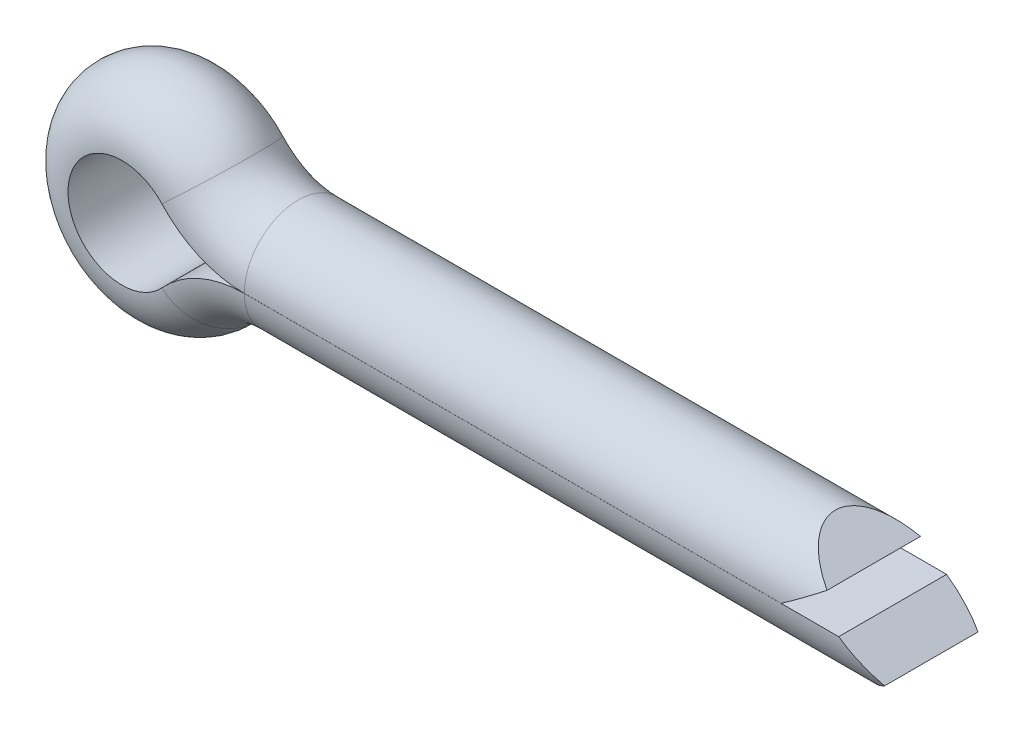
ISO-10303-21;
HEADER;
FILE_DESCRIPTION(('STEP AP214'),'2;1');
FILE_NAME('part.step','',(''),(''),'','','');
FILE_SCHEMA(('AUTOMOTIVE_DESIGN { 1 0 10303 214 1 1 1 1 }'));
ENDSEC;
DATA;
#1=APPLICATION_CONTEXT('core data for automotive mechanical design processes');
#2=APPLICATION_PROTOCOL_DEFINITION('international standard','automotive_design',2000,#1);
#3=PRODUCT_CONTEXT('',#1,'mechanical');
#4=PRODUCT('Part','Part','',(#3));
#5=PRODUCT_RELATED_PRODUCT_CATEGORY('part','',(#4));
#6=PRODUCT_DEFINITION_FORMATION('','',#4);
#7=PRODUCT_DEFINITION_CONTEXT('part definition',#1,'design');
#8=PRODUCT_DEFINITION('design','',#6,#7);
#9=PRODUCT_DEFINITION_SHAPE('','',#8);
#10=(LENGTH_UNIT() NAMED_UNIT(*) SI_UNIT(.MILLI.,.METRE.));
#11=(NAMED_UNIT(*) PLANE_ANGLE_UNIT() SI_UNIT($,.RADIAN.));
#12=(NAMED_UNIT(*) SI_UNIT($,.STERADIAN.) SOLID_ANGLE_UNIT());
#13=UNCERTAINTY_MEASURE_WITH_UNIT(LENGTH_MEASURE(1.E-05),#10,'distance_accuracy_value','');
#14=(GEOMETRIC_REPRESENTATION_CONTEXT(3) GLOBAL_UNCERTAINTY_ASSIGNED_CONTEXT((#13)) GLOBAL_UNIT_ASSIGNED_CONTEXT((#10,
#11,#12)) REPRESENTATION_CONTEXT('',''));
#15=CARTESIAN_POINT('',(0.,0.,0.));
#16=DIRECTION('',(0.,0.,1.));
#17=DIRECTION('',(1.,0.,0.));
#18=AXIS2_PLACEMENT_3D('',#15,#16,#17);
#19=CARTESIAN_POINT('',(0.,-0.00199999999999983,3.74999946666663));
#20=DIRECTION('',(0.,-1.,0.));
#21=DIRECTION('',(1.,0.,0.));
#22=AXIS2_PLACEMENT_3D('',#19,#20,#21);
#23=PLANE('',#22);
#24=DIRECTION('',(1.,0.,0.));
#25=VECTOR('',#24,1.);
#26=CARTESIAN_POINT('',(0.,-0.00199999999999983,3.74999946666663));
#27=LINE('',#26,#25);
#28=CARTESIAN_POINT('',(0.,-0.00199999999999983,3.74999946666663));
#29=VERTEX_POINT('',#28);
#30=CARTESIAN_POINT('',(41.3151462893286,-0.00200000000000005,3.74999946666663));
#31=VERTEX_POINT('',#30);
#32=EDGE_CURVE('E43',#29,#31,#27,.T.);
#33=ORIENTED_EDGE('',*,*,#32,.T.);
#34=DIRECTION('',(0.,0.,-1.));
#35=VECTOR('',#34,1.);
#36=CARTESIAN_POINT('',(41.3151462893286,-0.00200000000000065,3.74999946666663));
#37=LINE('',#36,#35);
#38=CARTESIAN_POINT('',(41.3151462893286,-0.00200000000000005,-3.74999946666663));
#39=VERTEX_POINT('',#38);
#40=EDGE_CURVE('E99',#31,#39,#37,.T.);
#41=ORIENTED_EDGE('',*,*,#40,.T.);
#42=DIRECTION('',(1.,0.,0.));
#43=VECTOR('',#42,1.);
#44=CARTESIAN_POINT('',(0.,-0.00199999999999983,-3.74999946666663));
#45=LINE('',#44,#43);
#46=CARTESIAN_POINT('',(0.,-0.00199999999999983,-3.74999946666663));
#47=VERTEX_POINT('',#46);
#48=EDGE_CURVE('E11',#47,#39,#45,.T.);
#49=ORIENTED_EDGE('',*,*,#48,.F.);
#50=DIRECTION('',(0.,0.,-1.));
#51=VECTOR('',#50,1.);
#52=CARTESIAN_POINT('',(0.,-0.00199999999999983,3.74999946666663));
#53=LINE('',#52,#51);
#54=EDGE_CURVE('E116',#29,#47,#53,.T.);
#55=ORIENTED_EDGE('',*,*,#54,.F.);
#56=EDGE_LOOP('',(#33,#41,#49,#55));
#57=FACE_BOUND('',#56,.T.);
#58=ADVANCED_FACE('F36',(#57),#23,.F.);
#59=CARTESIAN_POINT('',(0.,0.,0.));
#60=DIRECTION('',(1.,0.,0.));
#61=DIRECTION('',(0.,1.,0.));
#62=AXIS2_PLACEMENT_3D('',#59,#60,#61);
#63=CYLINDRICAL_SURFACE('',#62,3.75);
#64=CARTESIAN_POINT('',(46.6707283888811,0.,0.));
#65=DIRECTION('',(-0.574796173863874,0.818296620127109,0.));
#66=DIRECTION('',(0.818296620127109,0.574796173863874,0.));
#67=AXIS2_PLACEMENT_3D('',#64,#65,#66);
#68=ELLIPSE('',#67,6.5240517778535,3.75);
#69=CARTESIAN_POINT('',(44.0000000000001,-1.87600000000001,-3.24701770860584));
#70=VERTEX_POINT('',#69);
#71=CARTESIAN_POINT('',(44.0000000000001,-1.876,3.24701770860584));
#72=VERTEX_POINT('',#71);
#73=EDGE_CURVE('E113',#70,#72,#68,.T.);
#74=ORIENTED_EDGE('',*,*,#73,.T.);
#75=CARTESIAN_POINT('',(41.312280917172,0.,0.));
#76=DIRECTION('',(-0.572355425779526,-0.820005650334641,0.));
#77=DIRECTION('',(0.820005650334641,-0.572355425779526,0.));
#78=AXIS2_PLACEMENT_3D('',#75,#76,#77);
#79=ELLIPSE('',#78,6.55187289417697,3.75);
#80=EDGE_CURVE('E102',#72,#31,#79,.T.);
#81=ORIENTED_EDGE('',*,*,#80,.T.);
#82=ORIENTED_EDGE('',*,*,#32,.F.);
#83=CARTESIAN_POINT('',(0.,0.,0.));
#84=DIRECTION('',(-1.,0.,0.));
#85=DIRECTION('',(0.,0.,-1.));
#86=AXIS2_PLACEMENT_3D('',#83,#84,#85);
#87=CIRCLE('',#86,3.75);
#88=EDGE_CURVE('E126',#47,#29,#87,.T.);
#89=ORIENTED_EDGE('',*,*,#88,.F.);
#90=ORIENTED_EDGE('',*,*,#48,.T.);
#91=EDGE_CURVE('E104',#39,#70,#79,.T.);
#92=ORIENTED_EDGE('',*,*,#91,.T.);
#93=EDGE_LOOP('',(#74,#81,#82,#89,#90,#92));
#94=FACE_BOUND('',#93,.T.);
#95=ADVANCED_FACE('F110',(#94),#63,.T.);
#96=CARTESIAN_POINT('',(0.,-7.75833333333333,0.));
#97=DIRECTION('',(0.,0.,-1.));
#98=DIRECTION('',(-1.,0.,0.));
#99=AXIS2_PLACEMENT_3D('',#96,#97,#98);
#100=CYLINDRICAL_SURFACE('',#99,7.75633333333333);
#101=DIRECTION('',(0.,0.,-1.));
#102=VECTOR('',#101,1.);
#103=CARTESIAN_POINT('',(-5.72879073135406,-2.52940767559735,3.74999946666663));
#104=LINE('',#103,#102);
#105=CARTESIAN_POINT('',(-5.72879073135406,-2.52940767559735,3.74999946666663));
#106=VERTEX_POINT('',#105);
#107=CARTESIAN_POINT('',(-5.72879073135406,-2.52940767559735,-3.74999946666663));
#108=VERTEX_POINT('',#107);
#109=EDGE_CURVE('E134',#106,#108,#104,.T.);
#110=ORIENTED_EDGE('',*,*,#109,.F.);
#111=CARTESIAN_POINT('',(0.,-7.75833333333333,3.74999946666663));
#112=DIRECTION('',(0.,0.,-1.));
#113=DIRECTION('',(-1.,0.,0.));
#114=AXIS2_PLACEMENT_3D('',#111,#112,#113);
#115=CIRCLE('',#114,7.75633333333333);
#116=EDGE_CURVE('E120',#106,#29,#115,.T.);
#117=ORIENTED_EDGE('',*,*,#116,.T.);
#118=ORIENTED_EDGE('',*,*,#54,.T.);
#119=CARTESIAN_POINT('',(0.,-7.75833333333333,-3.74999946666663));
#120=DIRECTION('',(0.,0.,-1.));
#121=DIRECTION('',(-1.,0.,0.));
#122=AXIS2_PLACEMENT_3D('',#119,#120,#121);
#123=CIRCLE('',#122,7.75633333333333);
#124=EDGE_CURVE('E118',#108,#47,#123,.T.);
#125=ORIENTED_EDGE('',*,*,#124,.F.);
#126=EDGE_LOOP('',(#110,#117,#118,#125));
#127=FACE_BOUND('',#126,.T.);
#128=ADVANCED_FACE('F199',(#127),#100,.T.);
#129=CARTESIAN_POINT('',(0.,-7.75833333333333,0.));
#130=DIRECTION('',(0.,0.,-1.));
#131=DIRECTION('',(-1.,0.,0.));
#132=AXIS2_PLACEMENT_3D('',#129,#130,#131);
#133=TOROIDAL_SURFACE('',#132,7.75833333333333,3.75);
#134=CARTESIAN_POINT('',(-5.73026792179577,-2.52805937726281,0.));
#135=DIRECTION('',(-0.674149167270083,-0.738595220854463,0.));
#136=DIRECTION('',(0.,0.,-1.));
#137=AXIS2_PLACEMENT_3D('',#134,#135,#136);
#138=CIRCLE('',#137,3.75);
#139=EDGE_CURVE('E137',#108,#106,#138,.T.);
#140=ORIENTED_EDGE('',*,*,#139,.F.);
#141=ORIENTED_EDGE('',*,*,#124,.T.);
#142=ORIENTED_EDGE('',*,*,#88,.T.);
#143=ORIENTED_EDGE('',*,*,#116,.F.);
#144=EDGE_LOOP('',(#140,#141,#142,#143));
#145=FACE_BOUND('',#144,.T.);
#146=ADVANCED_FACE('F201',(#145),#133,.T.);
#147=CARTESIAN_POINT('',(-8.5,0.,0.));
#148=DIRECTION('',(0.,0.,1.));
#149=DIRECTION('',(1.,0.,0.));
#150=AXIS2_PLACEMENT_3D('',#147,#148,#149);
#151=CYLINDRICAL_SURFACE('',#150,3.752);
#152=DIRECTION('',(0.,0.,-1.));
#153=VECTOR('',#152,1.);
#154=CARTESIAN_POINT('',(-5.72879073135409,2.52940767559739,3.74999946666663));
#155=LINE('',#154,#153);
#156=CARTESIAN_POINT('',(-5.72879073135409,2.52940767559739,3.74999946666663));
#157=VERTEX_POINT('',#156);
#158=CARTESIAN_POINT('',(-5.72879073135409,2.52940767559739,-3.74999946666663));
#159=VERTEX_POINT('',#158);
#160=EDGE_CURVE('E146',#157,#159,#155,.T.);
#161=ORIENTED_EDGE('',*,*,#160,.F.);
#162=CARTESIAN_POINT('',(-8.5,0.,3.74999946666663));
#163=DIRECTION('',(0.,0.,1.));
#164=DIRECTION('',(1.,0.,0.));
#165=AXIS2_PLACEMENT_3D('',#162,#163,#164);
#166=CIRCLE('',#165,3.752);
#167=EDGE_CURVE('E131',#157,#106,#166,.T.);
#168=ORIENTED_EDGE('',*,*,#167,.T.);
#169=ORIENTED_EDGE('',*,*,#109,.T.);
#170=CARTESIAN_POINT('',(-8.5,0.,-3.74999946666663));
#171=DIRECTION('',(0.,0.,1.));
#172=DIRECTION('',(1.,0.,0.));
#173=AXIS2_PLACEMENT_3D('',#170,#171,#172);
#174=CIRCLE('',#173,3.752);
#175=EDGE_CURVE('E128',#159,#108,#174,.T.);
#176=ORIENTED_EDGE('',*,*,#175,.F.);
#177=EDGE_LOOP('',(#161,#168,#169,#176));
#178=FACE_BOUND('',#177,.T.);
#179=ADVANCED_FACE('F196',(#178),#151,.F.);
#180=CARTESIAN_POINT('',(-8.5,0.,0.));
#181=DIRECTION('',(0.,0.,1.));
#182=DIRECTION('',(1.,0.,0.));
#183=AXIS2_PLACEMENT_3D('',#180,#181,#182);
#184=DEGENERATE_TOROIDAL_SURFACE('',#183,3.75,3.75,.T.);
#185=CARTESIAN_POINT('',(-5.7302679217958,2.52805937726285,0.));
#186=DIRECTION('',(0.674149167270094,-0.738595220854453,0.));
#187=DIRECTION('',(0.,0.,-1.));
#188=AXIS2_PLACEMENT_3D('',#185,#186,#187);
#189=CIRCLE('',#188,3.75);
#190=EDGE_CURVE('E149',#159,#157,#189,.T.);
#191=ORIENTED_EDGE('',*,*,#190,.F.);
#192=ORIENTED_EDGE('',*,*,#175,.T.);
#193=ORIENTED_EDGE('',*,*,#139,.T.);
#194=ORIENTED_EDGE('',*,*,#167,.F.);
#195=EDGE_LOOP('',(#191,#192,#193,#194));
#196=FACE_BOUND('',#195,.T.);
#197=ADVANCED_FACE('F193',(#196),#184,.T.);
#198=CARTESIAN_POINT('',(0.,7.75833333333333,0.));
#199=DIRECTION('',(0.,0.,-1.));
#200=DIRECTION('',(-1.,0.,0.));
#201=AXIS2_PLACEMENT_3D('',#198,#199,#200);
#202=CYLINDRICAL_SURFACE('',#201,7.75633333333333);
#203=DIRECTION('',(0.,0.,-1.));
#204=VECTOR('',#203,1.);
#205=CARTESIAN_POINT('',(0.,0.00199999999999913,3.74999946666663));
#206=LINE('',#205,#204);
#207=CARTESIAN_POINT('',(0.,0.00199999999999913,3.74999946666663));
#208=VERTEX_POINT('',#207);
#209=CARTESIAN_POINT('',(0.,0.00199999999999913,-3.74999946666663));
#210=VERTEX_POINT('',#209);
#211=EDGE_CURVE('E156',#208,#210,#206,.T.);
#212=ORIENTED_EDGE('',*,*,#211,.F.);
#213=CARTESIAN_POINT('',(0.,7.75833333333333,3.74999946666663));
#214=DIRECTION('',(0.,0.,-1.));
#215=DIRECTION('',(-1.,0.,0.));
#216=AXIS2_PLACEMENT_3D('',#213,#214,#215);
#217=CIRCLE('',#216,7.75633333333333);
#218=EDGE_CURVE('E143',#208,#157,#217,.T.);
#219=ORIENTED_EDGE('',*,*,#218,.T.);
#220=ORIENTED_EDGE('',*,*,#160,.T.);
#221=CARTESIAN_POINT('',(0.,7.75833333333333,-3.74999946666663));
#222=DIRECTION('',(0.,0.,-1.));
#223=DIRECTION('',(-1.,0.,0.));
#224=AXIS2_PLACEMENT_3D('',#221,#222,#223);
#225=CIRCLE('',#224,7.75633333333333);
#226=EDGE_CURVE('E140',#210,#159,#225,.T.);
#227=ORIENTED_EDGE('',*,*,#226,.F.);
#228=EDGE_LOOP('',(#212,#219,#220,#227));
#229=FACE_BOUND('',#228,.T.);
#230=ADVANCED_FACE('F187',(#229),#202,.T.);
#231=CARTESIAN_POINT('',(0.,7.75833333333333,0.));
#232=DIRECTION('',(0.,0.,-1.));
#233=DIRECTION('',(-1.,0.,0.));
#234=AXIS2_PLACEMENT_3D('',#231,#232,#233);
#235=TOROIDAL_SURFACE('',#234,7.75833333333333,3.75);
#236=CARTESIAN_POINT('',(0.,0.,0.));
#237=DIRECTION('',(1.,0.,0.));
#238=DIRECTION('',(0.,0.,-1.));
#239=AXIS2_PLACEMENT_3D('',#236,#237,#238);
#240=CIRCLE('',#239,3.75);
#241=EDGE_CURVE('E161',#210,#208,#240,.T.);
#242=ORIENTED_EDGE('',*,*,#241,.F.);
#243=ORIENTED_EDGE('',*,*,#226,.T.);
#244=ORIENTED_EDGE('',*,*,#190,.T.);
#245=ORIENTED_EDGE('',*,*,#218,.F.);
#246=EDGE_LOOP('',(#242,#243,#244,#245));
#247=FACE_BOUND('',#246,.T.);
#248=ADVANCED_FACE('F190',(#247),#235,.T.);
#249=CARTESIAN_POINT('',(0.,0.,0.));
#250=DIRECTION('',(1.,0.,0.));
#251=DIRECTION('',(0.,1.,0.));
#252=AXIS2_PLACEMENT_3D('',#249,#250,#251);
#253=CYLINDRICAL_SURFACE('',#252,3.75);
#254=CARTESIAN_POINT('',(37.312280917172,0.,0.));
#255=DIRECTION('',(-0.572355425779527,0.82000565033464,0.));
#256=DIRECTION('',(0.82000565033464,0.572355425779527,0.));
#257=AXIS2_PLACEMENT_3D('',#254,#255,#256);
#258=ELLIPSE('',#257,6.55187289417696,3.75);
#259=CARTESIAN_POINT('',(40.,1.876,3.24701770860585));
#260=VERTEX_POINT('',#259);
#261=CARTESIAN_POINT('',(37.3151462893285,0.00199999999999994,3.74999946666663));
#262=VERTEX_POINT('',#261);
#263=EDGE_CURVE('E50',#260,#262,#258,.F.);
#264=ORIENTED_EDGE('',*,*,#263,.F.);
#265=CARTESIAN_POINT('',(42.670728388881,0.,0.));
#266=DIRECTION('',(-0.574796173863875,-0.818296620127109,0.));
#267=DIRECTION('',(0.818296620127109,-0.574796173863875,0.));
#268=AXIS2_PLACEMENT_3D('',#265,#266,#267);
#269=ELLIPSE('',#268,6.52405177785349,3.75);
#270=CARTESIAN_POINT('',(40.,1.876,-3.24701770860585));
#271=VERTEX_POINT('',#270);
#272=EDGE_CURVE('E169',#271,#260,#269,.F.);
#273=ORIENTED_EDGE('',*,*,#272,.F.);
#274=CARTESIAN_POINT('',(37.3151462893285,0.0020000000000014,-3.74999946666663));
#275=VERTEX_POINT('',#274);
#276=EDGE_CURVE('E165',#275,#271,#258,.F.);
#277=ORIENTED_EDGE('',*,*,#276,.F.);
#278=DIRECTION('',(1.,0.,0.));
#279=VECTOR('',#278,1.);
#280=CARTESIAN_POINT('',(0.,0.00199999999999913,-3.74999946666663));
#281=LINE('',#280,#279);
#282=EDGE_CURVE('E152',#210,#275,#281,.T.);
#283=ORIENTED_EDGE('',*,*,#282,.F.);
#284=ORIENTED_EDGE('',*,*,#241,.T.);
#285=DIRECTION('',(1.,0.,0.));
#286=VECTOR('',#285,1.);
#287=CARTESIAN_POINT('',(0.,0.00199999999999913,3.74999946666663));
#288=LINE('',#287,#286);
#289=EDGE_CURVE('E153',#208,#262,#288,.T.);
#290=ORIENTED_EDGE('',*,*,#289,.T.);
#291=EDGE_LOOP('',(#264,#273,#277,#283,#284,#290));
#292=FACE_BOUND('',#291,.T.);
#293=ADVANCED_FACE('F179',(#292),#253,.T.);
#294=CARTESIAN_POINT('',(0.,0.00199999999999913,3.74999946666663));
#295=DIRECTION('',(0.,-1.,0.));
#296=DIRECTION('',(1.,0.,0.));
#297=AXIS2_PLACEMENT_3D('',#294,#295,#296);
#298=PLANE('',#297);
#299=DIRECTION('',(0.,0.,-1.));
#300=VECTOR('',#299,1.);
#301=CARTESIAN_POINT('',(37.3151462893285,0.00199999999999994,3.74999946666663));
#302=LINE('',#301,#300);
#303=EDGE_CURVE('E167',#262,#275,#302,.T.);
#304=ORIENTED_EDGE('',*,*,#303,.F.);
#305=ORIENTED_EDGE('',*,*,#289,.F.);
#306=ORIENTED_EDGE('',*,*,#211,.T.);
#307=ORIENTED_EDGE('',*,*,#282,.T.);
#308=EDGE_LOOP('',(#304,#305,#306,#307));
#309=FACE_BOUND('',#308,.T.);
#310=ADVANCED_FACE('F184',(#309),#298,.T.);
#311=CARTESIAN_POINT('',(40.,1.876,-3.74999946666663));
#312=DIRECTION('',(-0.572355425779527,0.82000565033464,0.));
#313=DIRECTION('',(-0.82000565033464,-0.572355425779527,0.));
#314=AXIS2_PLACEMENT_3D('',#311,#312,#313);
#315=PLANE('',#314);
#316=ORIENTED_EDGE('',*,*,#263,.T.);
#317=ORIENTED_EDGE('',*,*,#303,.T.);
#318=ORIENTED_EDGE('',*,*,#276,.T.);
#319=DIRECTION('',(0.,0.,1.));
#320=VECTOR('',#319,1.);
#321=CARTESIAN_POINT('',(40.,1.876,-3.74999946666663));
#322=LINE('',#321,#320);
#323=EDGE_CURVE('E171',#271,#260,#322,.T.);
#324=ORIENTED_EDGE('',*,*,#323,.T.);
#325=EDGE_LOOP('',(#316,#317,#318,#324));
#326=FACE_BOUND('',#325,.T.);
#327=ADVANCED_FACE('F174',(#326),#315,.F.);
#328=CARTESIAN_POINT('',(40.,1.876,-3.74999946666663));
#329=DIRECTION('',(-0.574796173863875,-0.818296620127109,0.));
#330=DIRECTION('',(0.818296620127109,-0.574796173863875,0.));
#331=AXIS2_PLACEMENT_3D('',#328,#329,#330);
#332=PLANE('',#331);
#333=ORIENTED_EDGE('',*,*,#272,.T.);
#334=ORIENTED_EDGE('',*,*,#323,.F.);
#335=EDGE_LOOP('',(#333,#334));
#336=FACE_BOUND('',#335,.T.);
#337=ADVANCED_FACE('F280',(#336),#332,.F.);
#338=CARTESIAN_POINT('',(44.0000000000001,-1.876,-3.74999946666663));
#339=DIRECTION('',(-0.574796173863874,0.818296620127109,0.));
#340=DIRECTION('',(-0.818296620127109,-0.574796173863874,0.));
#341=AXIS2_PLACEMENT_3D('',#338,#339,#340);
#342=PLANE('',#341);
#343=DIRECTION('',(0.,0.,1.));
#344=VECTOR('',#343,1.);
#345=CARTESIAN_POINT('',(44.0000000000001,-1.876,-3.74999946666663));
#346=LINE('',#345,#344);
#347=EDGE_CURVE('E58',#70,#72,#346,.T.);
#348=ORIENTED_EDGE('',*,*,#347,.T.);
#349=ORIENTED_EDGE('',*,*,#73,.F.);
#350=EDGE_LOOP('',(#348,#349));
#351=FACE_BOUND('',#350,.T.);
#352=ADVANCED_FACE('F287',(#351),#342,.F.);
#353=CARTESIAN_POINT('',(44.0000000000001,-1.876,-3.74999946666663));
#354=DIRECTION('',(-0.572355425779526,-0.820005650334641,0.));
#355=DIRECTION('',(0.820005650334641,-0.572355425779526,0.));
#356=AXIS2_PLACEMENT_3D('',#353,#354,#355);
#357=PLANE('',#356);
#358=ORIENTED_EDGE('',*,*,#347,.F.);
#359=ORIENTED_EDGE('',*,*,#91,.F.);
#360=ORIENTED_EDGE('',*,*,#40,.F.);
#361=ORIENTED_EDGE('',*,*,#80,.F.);
#362=EDGE_LOOP('',(#358,#359,#360,#361));
#363=FACE_BOUND('',#362,.T.);
#364=ADVANCED_FACE('F101',(#363),#357,.F.);
#365=CLOSED_SHELL('',(#58,#95,#128,#146,#179,#197,#230,#248,#293,#310,#327,#337,#352,#364));
#366=MANIFOLD_SOLID_BREP('B2',#365);
#367=ADVANCED_BREP_SHAPE_REPRESENTATION('',(#18,#366),#14);
#368=SHAPE_DEFINITION_REPRESENTATION(#9,#367);
ENDSEC;
END-ISO-10303-21;
